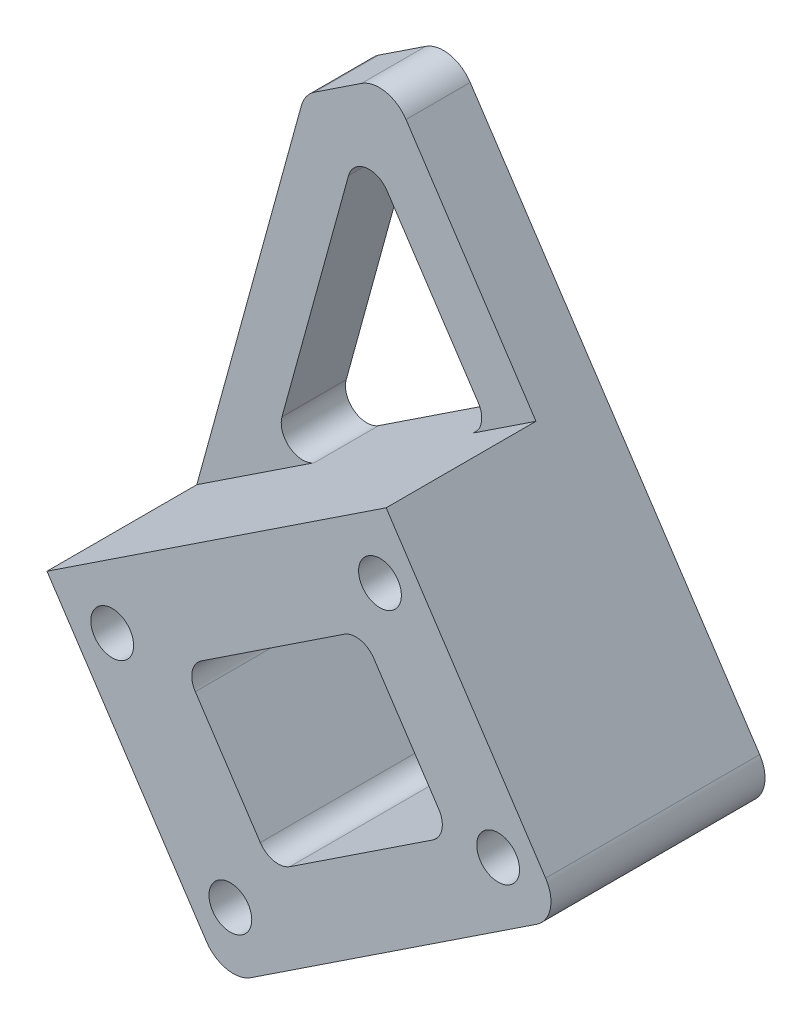
ISO-10303-21;
HEADER;
FILE_DESCRIPTION(('STEP AP214'),'2;1');
FILE_NAME('part.step','',(''),(''),'','','');
FILE_SCHEMA(('AUTOMOTIVE_DESIGN { 1 0 10303 214 1 1 1 1 }'));
ENDSEC;
DATA;
#1=APPLICATION_CONTEXT('core data for automotive mechanical design processes');
#2=APPLICATION_PROTOCOL_DEFINITION('international standard','automotive_design',2000,#1);
#3=PRODUCT_CONTEXT('',#1,'mechanical');
#4=PRODUCT('Part','Part','',(#3));
#5=PRODUCT_RELATED_PRODUCT_CATEGORY('part','',(#4));
#6=PRODUCT_DEFINITION_FORMATION('','',#4);
#7=PRODUCT_DEFINITION_CONTEXT('part definition',#1,'design');
#8=PRODUCT_DEFINITION('design','',#6,#7);
#9=PRODUCT_DEFINITION_SHAPE('','',#8);
#10=(LENGTH_UNIT() NAMED_UNIT(*) SI_UNIT(.MILLI.,.METRE.));
#11=(NAMED_UNIT(*) PLANE_ANGLE_UNIT() SI_UNIT($,.RADIAN.));
#12=(NAMED_UNIT(*) SI_UNIT($,.STERADIAN.) SOLID_ANGLE_UNIT());
#13=UNCERTAINTY_MEASURE_WITH_UNIT(LENGTH_MEASURE(1.E-05),#10,'distance_accuracy_value','');
#14=(GEOMETRIC_REPRESENTATION_CONTEXT(3) GLOBAL_UNCERTAINTY_ASSIGNED_CONTEXT((#13)) GLOBAL_UNIT_ASSIGNED_CONTEXT((#10,
#11,#12)) REPRESENTATION_CONTEXT('',''));
#15=CARTESIAN_POINT('',(0.,0.,0.));
#16=DIRECTION('',(0.,0.,1.));
#17=DIRECTION('',(1.,0.,0.));
#18=AXIS2_PLACEMENT_3D('',#15,#16,#17);
#19=CARTESIAN_POINT('',(-6.14019511825467,-29.2611944056386,20.));
#20=DIRECTION('',(0.,0.,1.));
#21=DIRECTION('',(1.,0.,0.));
#22=AXIS2_PLACEMENT_3D('',#19,#20,#21);
#23=PLANE('',#22);
#24=DIRECTION('',(0.833885822066982,0.55193698531234,0.));
#25=VECTOR('',#24,1.);
#26=CARTESIAN_POINT('',(-12.5539669439001,-1.12784389978526,20.));
#27=LINE('',#26,#25);
#28=CARTESIAN_POINT('',(-23.5441511878888,-8.40208816576704,20.));
#29=VERTEX_POINT('',#28);
#30=CARTESIAN_POINT('',(8.14351005065652,12.5715172761019,20.));
#31=VERTEX_POINT('',#30);
#32=EDGE_CURVE('E301',#29,#31,#27,.T.);
#33=ORIENTED_EDGE('',*,*,#32,.F.);
#34=DIRECTION('',(0.55193698531234,-0.833885822066982,0.));
#35=VECTOR('',#34,1.);
#36=CARTESIAN_POINT('',(-23.5441511878888,-8.40208816576704,20.));
#37=LINE('',#36,#35);
#38=CARTESIAN_POINT('',(-8.64185258445563,-30.9170053615756,20.));
#39=VERTEX_POINT('',#38);
#40=EDGE_CURVE('E236',#29,#39,#37,.T.);
#41=ORIENTED_EDGE('',*,*,#40,.T.);
#42=CARTESIAN_POINT('',(-6.14019511825467,-29.2611944056386,20.));
#43=DIRECTION('',(0.,0.,1.));
#44=DIRECTION('',(1.,0.,0.));
#45=AXIS2_PLACEMENT_3D('',#42,#43,#44);
#46=CIRCLE('',#45,2.99999999999999);
#47=CARTESIAN_POINT('',(-4.48438416231764,-31.7628518718395,20.));
#48=VERTEX_POINT('',#47);
#49=EDGE_CURVE('E261',#39,#48,#46,.T.);
#50=ORIENTED_EDGE('',*,*,#49,.T.);
#51=DIRECTION('',(0.833885822066982,0.55193698531234,0.));
#52=VECTOR('',#51,1.);
#53=CARTESIAN_POINT('',(-4.48438416231764,-31.7628518718395,20.));
#54=LINE('',#53,#52);
#55=CARTESIAN_POINT('',(22.1999621438258,-14.1008683418447,20.));
#56=VERTEX_POINT('',#55);
#57=EDGE_CURVE('E291',#48,#56,#54,.T.);
#58=ORIENTED_EDGE('',*,*,#57,.T.);
#59=CARTESIAN_POINT('',(20.5441511878888,-11.5992108756437,20.));
#60=DIRECTION('',(0.,0.,1.));
#61=DIRECTION('',(1.,0.,0.));
#62=AXIS2_PLACEMENT_3D('',#59,#60,#61);
#63=CIRCLE('',#62,3.);
#64=CARTESIAN_POINT('',(23.0458086540897,-9.94339991970666,20.));
#65=VERTEX_POINT('',#64);
#66=EDGE_CURVE('E295',#56,#65,#63,.T.);
#67=ORIENTED_EDGE('',*,*,#66,.T.);
#68=DIRECTION('',(-0.551936985312339,0.833885822066982,0.));
#69=VECTOR('',#68,1.);
#70=CARTESIAN_POINT('',(23.0458086540897,-9.94339991970666,20.));
#71=LINE('',#70,#69);
#72=EDGE_CURVE('E232',#65,#31,#71,.T.);
#73=ORIENTED_EDGE('',*,*,#72,.T.);
#74=EDGE_LOOP('',(#33,#41,#50,#58,#67,#73));
#75=FACE_BOUND('',#74,.T.);
#76=CARTESIAN_POINT('',(-17.4489229730591,-10.3637693348526,20.));
#77=DIRECTION('',(0.,0.,1.));
#78=DIRECTION('',(1.,0.,0.));
#79=AXIS2_PLACEMENT_3D('',#76,#77,#78);
#80=CIRCLE('',#79,1.99999999999999);
#81=CARTESIAN_POINT('',(-15.4489229730591,-10.3637693348526,20.));
#82=VERTEX_POINT('',#81);
#83=EDGE_CURVE('E364',#82,#82,#80,.T.);
#84=ORIENTED_EDGE('',*,*,#83,.F.);
#85=EDGE_LOOP('',(#84));
#86=FACE_BOUND('',#85,.T.);
#87=CARTESIAN_POINT('',(18.6063913951971,-10.483376216822,20.));
#88=DIRECTION('',(0.,0.,1.));
#89=DIRECTION('',(1.,0.,0.));
#90=AXIS2_PLACEMENT_3D('',#87,#88,#89);
#91=CIRCLE('',#90,2.00000000000001);
#92=CARTESIAN_POINT('',(20.6063913951971,-10.483376216822,20.));
#93=VERTEX_POINT('',#92);
#94=EDGE_CURVE('E376',#93,#93,#91,.T.);
#95=ORIENTED_EDGE('',*,*,#94,.F.);
#96=EDGE_LOOP('',(#95));
#97=FACE_BOUND('',#96,.T.);
#98=DIRECTION('',(0.551936985312339,-0.833885822066982,0.));
#99=VECTOR('',#98,1.);
#100=CARTESIAN_POINT('',(-9.68592311409555,-11.2215765333135,20.));
#101=LINE('',#100,#99);
#102=CARTESIAN_POINT('',(-9.68592311409555,-11.2215765333135,20.));
#103=VERTEX_POINT('',#102);
#104=CARTESIAN_POINT('',(-3.61461627565982,-20.3943205760503,20.));
#105=VERTEX_POINT('',#104);
#106=EDGE_CURVE('E384',#103,#105,#101,.T.);
#107=ORIENTED_EDGE('',*,*,#106,.F.);
#108=CARTESIAN_POINT('',(-8.0181514699616,-10.1177025626888,20.));
#109=DIRECTION('',(0.,0.,1.));
#110=DIRECTION('',(1.,0.,0.));
#111=AXIS2_PLACEMENT_3D('',#108,#109,#110);
#112=CIRCLE('',#111,1.99999999999999);
#113=CARTESIAN_POINT('',(-9.12202544058627,-8.44993091855484,20.));
#114=VERTEX_POINT('',#113);
#115=EDGE_CURVE('E382',#114,#103,#112,.T.);
#116=ORIENTED_EDGE('',*,*,#115,.F.);
#117=DIRECTION('',(-0.833885822066983,-0.551936985312339,0.));
#118=VECTOR('',#117,1.);
#119=CARTESIAN_POINT('',(4.22014771248544,0.381060846442571,20.));
#120=LINE('',#119,#118);
#121=CARTESIAN_POINT('',(4.22014771248545,0.381060846442573,20.));
#122=VERTEX_POINT('',#121);
#123=EDGE_CURVE('E398',#122,#114,#120,.T.);
#124=ORIENTED_EDGE('',*,*,#123,.F.);
#125=CARTESIAN_POINT('',(5.32402168311014,-1.28671079769138,20.));
#126=DIRECTION('',(0.,0.,1.));
#127=DIRECTION('',(1.,0.,0.));
#128=AXIS2_PLACEMENT_3D('',#125,#126,#127);
#129=CIRCLE('',#128,1.99999999999999);
#130=CARTESIAN_POINT('',(6.99179332724409,-0.182836827066712,20.));
#131=VERTEX_POINT('',#130);
#132=EDGE_CURVE('E395',#131,#122,#129,.T.);
#133=ORIENTED_EDGE('',*,*,#132,.F.);
#134=DIRECTION('',(-0.551936985312341,0.833885822066981,0.));
#135=VECTOR('',#134,1.);
#136=CARTESIAN_POINT('',(13.0631001656798,-9.35558086980348,20.));
#137=LINE('',#136,#135);
#138=CARTESIAN_POINT('',(13.0631001656798,-9.35558086980347,20.));
#139=VERTEX_POINT('',#138);
#140=EDGE_CURVE('E393',#139,#131,#137,.T.);
#141=ORIENTED_EDGE('',*,*,#140,.F.);
#142=CARTESIAN_POINT('',(11.3953285215458,-10.4594548404282,20.));
#143=DIRECTION('',(0.,0.,1.));
#144=DIRECTION('',(1.,0.,0.));
#145=AXIS2_PLACEMENT_3D('',#142,#143,#144);
#146=CIRCLE('',#145,2.00000000000003);
#147=CARTESIAN_POINT('',(12.4992024921705,-12.1272264845622,20.));
#148=VERTEX_POINT('',#147);
#149=EDGE_CURVE('E391',#148,#139,#146,.T.);
#150=ORIENTED_EDGE('',*,*,#149,.F.);
#151=DIRECTION('',(0.833885822066983,0.551936985312339,0.));
#152=VECTOR('',#151,1.);
#153=CARTESIAN_POINT('',(-0.842970660901166,-20.9582182495596,20.));
#154=LINE('',#153,#152);
#155=CARTESIAN_POINT('',(-0.84297066090117,-20.9582182495596,20.));
#156=VERTEX_POINT('',#155);
#157=EDGE_CURVE('E389',#156,#148,#154,.T.);
#158=ORIENTED_EDGE('',*,*,#157,.F.);
#159=CARTESIAN_POINT('',(-1.94684463152586,-19.2904466054256,20.));
#160=DIRECTION('',(0.,0.,1.));
#161=DIRECTION('',(1.,0.,0.));
#162=AXIS2_PLACEMENT_3D('',#159,#160,#161);
#163=CIRCLE('',#162,1.99999999999999);
#164=EDGE_CURVE('E387',#105,#156,#163,.T.);
#165=ORIENTED_EDGE('',*,*,#164,.F.);
#166=EDGE_LOOP('',(#107,#116,#124,#133,#141,#150,#158,#165));
#167=FACE_BOUND('',#166,.T.);
#168=CARTESIAN_POINT('',(-6.41018326681236,-27.0414857761923,20.));
#169=DIRECTION('',(0.,0.,1.));
#170=DIRECTION('',(1.,0.,0.));
#171=AXIS2_PLACEMENT_3D('',#168,#169,#170);
#172=CIRCLE('',#171,2.);
#173=CARTESIAN_POINT('',(-4.41018326681237,-27.0414857761923,20.));
#174=VERTEX_POINT('',#173);
#175=EDGE_CURVE('E370',#174,#174,#172,.T.);
#176=ORIENTED_EDGE('',*,*,#175,.F.);
#177=EDGE_LOOP('',(#176));
#178=FACE_BOUND('',#177,.T.);
#179=CARTESIAN_POINT('',(7.56765168895032,6.19434022451759,20.));
#180=DIRECTION('',(0.,0.,1.));
#181=DIRECTION('',(1.,0.,0.));
#182=AXIS2_PLACEMENT_3D('',#179,#180,#181);
#183=CIRCLE('',#182,2.);
#184=CARTESIAN_POINT('',(9.56765168895032,6.19434022451759,20.));
#185=VERTEX_POINT('',#184);
#186=EDGE_CURVE('E329',#185,#185,#183,.T.);
#187=ORIENTED_EDGE('',*,*,#186,.F.);
#188=EDGE_LOOP('',(#187));
#189=FACE_BOUND('',#188,.T.);
#190=ADVANCED_FACE('F40',(#75,#86,#97,#167,#178,#189),#23,.T.);
#191=CARTESIAN_POINT('',(-6.14019511825467,-29.2611944056386,0.));
#192=DIRECTION('',(0.,0.,1.));
#193=DIRECTION('',(1.,0.,0.));
#194=AXIS2_PLACEMENT_3D('',#191,#192,#193);
#195=PLANE('',#194);
#196=CARTESIAN_POINT('',(-17.4489229730591,-10.3637693348526,0.));
#197=DIRECTION('',(0.,0.,1.));
#198=DIRECTION('',(1.,0.,0.));
#199=AXIS2_PLACEMENT_3D('',#196,#197,#198);
#200=CIRCLE('',#199,1.99999999999999);
#201=CARTESIAN_POINT('',(-15.4489229730591,-10.3637693348526,0.));
#202=VERTEX_POINT('',#201);
#203=EDGE_CURVE('E363',#202,#202,#200,.T.);
#204=ORIENTED_EDGE('',*,*,#203,.T.);
#205=EDGE_LOOP('',(#204));
#206=FACE_BOUND('',#205,.T.);
#207=CARTESIAN_POINT('',(-6.41018326681236,-27.0414857761923,0.));
#208=DIRECTION('',(0.,0.,1.));
#209=DIRECTION('',(1.,0.,0.));
#210=AXIS2_PLACEMENT_3D('',#207,#208,#209);
#211=CIRCLE('',#210,2.);
#212=CARTESIAN_POINT('',(-4.41018326681237,-27.0414857761923,0.));
#213=VERTEX_POINT('',#212);
#214=EDGE_CURVE('E367',#213,#213,#211,.T.);
#215=ORIENTED_EDGE('',*,*,#214,.T.);
#216=EDGE_LOOP('',(#215));
#217=FACE_BOUND('',#216,.T.);
#218=CARTESIAN_POINT('',(18.6063913951971,-10.483376216822,0.));
#219=DIRECTION('',(0.,0.,1.));
#220=DIRECTION('',(1.,0.,0.));
#221=AXIS2_PLACEMENT_3D('',#218,#219,#220);
#222=CIRCLE('',#221,2.00000000000001);
#223=CARTESIAN_POINT('',(20.6063913951971,-10.483376216822,0.));
#224=VERTEX_POINT('',#223);
#225=EDGE_CURVE('E373',#224,#224,#222,.T.);
#226=ORIENTED_EDGE('',*,*,#225,.T.);
#227=EDGE_LOOP('',(#226));
#228=FACE_BOUND('',#227,.T.);
#229=CARTESIAN_POINT('',(-8.0181514699616,-10.1177025626888,0.));
#230=DIRECTION('',(0.,0.,1.));
#231=DIRECTION('',(1.,0.,0.));
#232=AXIS2_PLACEMENT_3D('',#229,#230,#231);
#233=CIRCLE('',#232,1.99999999999999);
#234=CARTESIAN_POINT('',(-9.12202544058627,-8.44993091855484,0.));
#235=VERTEX_POINT('',#234);
#236=CARTESIAN_POINT('',(-9.68592311409555,-11.2215765333135,0.));
#237=VERTEX_POINT('',#236);
#238=EDGE_CURVE('E379',#235,#237,#233,.T.);
#239=ORIENTED_EDGE('',*,*,#238,.T.);
#240=DIRECTION('',(0.551936985312339,-0.833885822066982,0.));
#241=VECTOR('',#240,1.);
#242=CARTESIAN_POINT('',(-9.68592311409555,-11.2215765333135,0.));
#243=LINE('',#242,#241);
#244=CARTESIAN_POINT('',(-3.61461627565982,-20.3943205760503,0.));
#245=VERTEX_POINT('',#244);
#246=EDGE_CURVE('E403',#237,#245,#243,.T.);
#247=ORIENTED_EDGE('',*,*,#246,.T.);
#248=CARTESIAN_POINT('',(-1.94684463152586,-19.2904466054256,0.));
#249=DIRECTION('',(0.,0.,1.));
#250=DIRECTION('',(1.,0.,0.));
#251=AXIS2_PLACEMENT_3D('',#248,#249,#250);
#252=CIRCLE('',#251,1.99999999999999);
#253=CARTESIAN_POINT('',(-0.84297066090117,-20.9582182495596,0.));
#254=VERTEX_POINT('',#253);
#255=EDGE_CURVE('E406',#245,#254,#252,.T.);
#256=ORIENTED_EDGE('',*,*,#255,.T.);
#257=DIRECTION('',(0.833885822066983,0.551936985312339,0.));
#258=VECTOR('',#257,1.);
#259=CARTESIAN_POINT('',(-0.842970660901166,-20.9582182495596,0.));
#260=LINE('',#259,#258);
#261=CARTESIAN_POINT('',(12.4992024921705,-12.1272264845622,0.));
#262=VERTEX_POINT('',#261);
#263=EDGE_CURVE('E409',#254,#262,#260,.T.);
#264=ORIENTED_EDGE('',*,*,#263,.T.);
#265=CARTESIAN_POINT('',(11.3953285215458,-10.4594548404282,0.));
#266=DIRECTION('',(0.,0.,1.));
#267=DIRECTION('',(1.,0.,0.));
#268=AXIS2_PLACEMENT_3D('',#265,#266,#267);
#269=CIRCLE('',#268,2.00000000000003);
#270=CARTESIAN_POINT('',(13.0631001656798,-9.35558086980347,0.));
#271=VERTEX_POINT('',#270);
#272=EDGE_CURVE('E412',#262,#271,#269,.T.);
#273=ORIENTED_EDGE('',*,*,#272,.T.);
#274=DIRECTION('',(-0.551936985312341,0.833885822066981,0.));
#275=VECTOR('',#274,1.);
#276=CARTESIAN_POINT('',(13.0631001656798,-9.35558086980348,0.));
#277=LINE('',#276,#275);
#278=CARTESIAN_POINT('',(6.99179332724409,-0.182836827066712,0.));
#279=VERTEX_POINT('',#278);
#280=EDGE_CURVE('E415',#271,#279,#277,.T.);
#281=ORIENTED_EDGE('',*,*,#280,.T.);
#282=CARTESIAN_POINT('',(5.32402168311014,-1.28671079769138,0.));
#283=DIRECTION('',(0.,0.,1.));
#284=DIRECTION('',(1.,0.,0.));
#285=AXIS2_PLACEMENT_3D('',#282,#283,#284);
#286=CIRCLE('',#285,1.99999999999999);
#287=CARTESIAN_POINT('',(4.22014771248544,0.381060846442565,0.));
#288=VERTEX_POINT('',#287);
#289=EDGE_CURVE('E418',#279,#288,#286,.T.);
#290=ORIENTED_EDGE('',*,*,#289,.T.);
#291=DIRECTION('',(-0.833885822066983,-0.551936985312339,0.));
#292=VECTOR('',#291,1.);
#293=CARTESIAN_POINT('',(4.22014771248544,0.381060846442571,0.));
#294=LINE('',#293,#292);
#295=EDGE_CURVE('E385',#288,#235,#294,.T.);
#296=ORIENTED_EDGE('',*,*,#295,.T.);
#297=EDGE_LOOP('',(#239,#247,#256,#264,#273,#281,#290,#296));
#298=FACE_BOUND('',#297,.T.);
#299=DIRECTION('',(0.55193698531234,-0.833885822066982,0.));
#300=VECTOR('',#299,1.);
#301=CARTESIAN_POINT('',(-23.5441511878888,-8.40208816576704,0.));
#302=LINE('',#301,#300);
#303=CARTESIAN_POINT('',(-23.5441511878888,-8.40208816576704,0.));
#304=VERTEX_POINT('',#303);
#305=CARTESIAN_POINT('',(-8.64185258445563,-30.9170053615756,0.));
#306=VERTEX_POINT('',#305);
#307=EDGE_CURVE('E262',#304,#306,#302,.T.);
#308=ORIENTED_EDGE('',*,*,#307,.F.);
#309=DIRECTION('',(-0.264870155924735,-0.964284087030584,0.));
#310=VECTOR('',#309,1.);
#311=CARTESIAN_POINT('',(-13.7775427468694,27.154145306643,0.));
#312=LINE('',#311,#310);
#313=CARTESIAN_POINT('',(-13.7775427468694,27.154145306643,0.));
#314=VERTEX_POINT('',#313);
#315=EDGE_CURVE('E228',#314,#304,#312,.T.);
#316=ORIENTED_EDGE('',*,*,#315,.F.);
#317=CARTESIAN_POINT('',(-10.8846904857777,26.3595348388687,0.));
#318=DIRECTION('',(0.,0.,1.));
#319=DIRECTION('',(1.,0.,0.));
#320=AXIS2_PLACEMENT_3D('',#317,#318,#319);
#321=CIRCLE('',#320,3.00000000000002);
#322=CARTESIAN_POINT('',(-12.5405014417147,28.8611923050697,0.));
#323=VERTEX_POINT('',#322);
#324=EDGE_CURVE('E285',#323,#314,#321,.T.);
#325=ORIENTED_EDGE('',*,*,#324,.F.);
#326=DIRECTION('',(-0.833885822066983,-0.551936985312337,0.));
#327=VECTOR('',#326,1.);
#328=CARTESIAN_POINT('',(-8.15657204835288,31.7628518718394,0.));
#329=LINE('',#328,#327);
#330=CARTESIAN_POINT('',(-8.15657204835288,31.7628518718394,0.));
#331=VERTEX_POINT('',#330);
#332=EDGE_CURVE('E283',#331,#323,#329,.T.);
#333=ORIENTED_EDGE('',*,*,#332,.F.);
#334=CARTESIAN_POINT('',(-6.50076109241587,29.2611944056385,0.));
#335=DIRECTION('',(0.,0.,1.));
#336=DIRECTION('',(1.,0.,0.));
#337=AXIS2_PLACEMENT_3D('',#334,#335,#336);
#338=CIRCLE('',#337,2.99999999999997);
#339=CARTESIAN_POINT('',(-3.99910362621493,30.9170053615754,0.));
#340=VERTEX_POINT('',#339);
#341=EDGE_CURVE('E280',#340,#331,#338,.T.);
#342=ORIENTED_EDGE('',*,*,#341,.F.);
#343=DIRECTION('',(-0.551936985312339,0.833885822066982,0.));
#344=VECTOR('',#343,1.);
#345=CARTESIAN_POINT('',(23.0458086540897,-9.94339991970666,0.));
#346=LINE('',#345,#344);
#347=CARTESIAN_POINT('',(23.0458086540897,-9.94339991970666,0.));
#348=VERTEX_POINT('',#347);
#349=EDGE_CURVE('E277',#348,#340,#346,.T.);
#350=ORIENTED_EDGE('',*,*,#349,.F.);
#351=CARTESIAN_POINT('',(20.5441511878888,-11.5992108756437,0.));
#352=DIRECTION('',(0.,0.,1.));
#353=DIRECTION('',(1.,0.,0.));
#354=AXIS2_PLACEMENT_3D('',#351,#352,#353);
#355=CIRCLE('',#354,3.);
#356=CARTESIAN_POINT('',(22.1999621438258,-14.1008683418447,0.));
#357=VERTEX_POINT('',#356);
#358=EDGE_CURVE('E275',#357,#348,#355,.T.);
#359=ORIENTED_EDGE('',*,*,#358,.F.);
#360=DIRECTION('',(0.833885822066982,0.55193698531234,0.));
#361=VECTOR('',#360,1.);
#362=CARTESIAN_POINT('',(-4.48438416231764,-31.7628518718395,0.));
#363=LINE('',#362,#361);
#364=CARTESIAN_POINT('',(-4.48438416231764,-31.7628518718395,0.));
#365=VERTEX_POINT('',#364);
#366=EDGE_CURVE('E266',#365,#357,#363,.T.);
#367=ORIENTED_EDGE('',*,*,#366,.F.);
#368=CARTESIAN_POINT('',(-6.14019511825467,-29.2611944056386,0.));
#369=DIRECTION('',(0.,0.,1.));
#370=DIRECTION('',(1.,0.,0.));
#371=AXIS2_PLACEMENT_3D('',#368,#369,#370);
#372=CIRCLE('',#371,2.99999999999999);
#373=EDGE_CURVE('E260',#306,#365,#372,.T.);
#374=ORIENTED_EDGE('',*,*,#373,.F.);
#375=EDGE_LOOP('',(#308,#316,#325,#333,#342,#350,#359,#367,#374));
#376=FACE_BOUND('',#375,.T.);
#377=CARTESIAN_POINT('',(-13.6578409145248,0.539927744348745,0.));
#378=DIRECTION('',(0.,0.,1.));
#379=DIRECTION('',(1.,0.,0.));
#380=AXIS2_PLACEMENT_3D('',#377,#378,#379);
#381=CIRCLE('',#380,2.);
#382=CARTESIAN_POINT('',(-15.5864090885859,1.06966805619818,0.));
#383=VERTEX_POINT('',#382);
#384=CARTESIAN_POINT('',(-12.5539669439001,-1.12784389978526,0.));
#385=VERTEX_POINT('',#384);
#386=EDGE_CURVE('E332',#383,#385,#381,.T.);
#387=ORIENTED_EDGE('',*,*,#386,.T.);
#388=DIRECTION('',(0.833885822066982,0.55193698531234,0.));
#389=VECTOR('',#388,1.);
#390=CARTESIAN_POINT('',(-12.5539669439001,-1.12784389978526,0.));
#391=LINE('',#390,#389);
#392=CARTESIAN_POINT('',(2.18139836922723,8.62528163992471,0.));
#393=VERTEX_POINT('',#392);
#394=EDGE_CURVE('E339',#385,#393,#391,.T.);
#395=ORIENTED_EDGE('',*,*,#394,.T.);
#396=CARTESIAN_POINT('',(1.07752439860254,10.2930532840587,0.));
#397=DIRECTION('',(0.,0.,1.));
#398=DIRECTION('',(1.,0.,0.));
#399=AXIS2_PLACEMENT_3D('',#396,#397,#398);
#400=CIRCLE('',#399,2.);
#401=CARTESIAN_POINT('',(2.74529604273651,11.3969272546833,0.));
#402=VERTEX_POINT('',#401);
#403=EDGE_CURVE('E342',#393,#402,#400,.T.);
#404=ORIENTED_EDGE('',*,*,#403,.T.);
#405=DIRECTION('',(-0.55193698531234,0.833885822066982,0.));
#406=VECTOR('',#405,1.);
#407=CARTESIAN_POINT('',(2.74529604273652,11.3969272546833,0.));
#408=LINE('',#407,#406);
#409=CARTESIAN_POINT('',(-5.77512440066252,24.269878324957,0.));
#410=VERTEX_POINT('',#409);
#411=EDGE_CURVE('E345',#402,#410,#408,.T.);
#412=ORIENTED_EDGE('',*,*,#411,.T.);
#413=CARTESIAN_POINT('',(-7.44289604479648,23.1660043543324,0.));
#414=DIRECTION('',(0.,0.,1.));
#415=DIRECTION('',(1.,0.,0.));
#416=AXIS2_PLACEMENT_3D('',#413,#414,#415);
#417=CIRCLE('',#416,2.00000000000001);
#418=CARTESIAN_POINT('',(-9.37146421885765,23.6957446661818,0.));
#419=VERTEX_POINT('',#418);
#420=EDGE_CURVE('E348',#410,#419,#417,.T.);
#421=ORIENTED_EDGE('',*,*,#420,.T.);
#422=DIRECTION('',(-0.264870155924733,-0.964284087030584,0.));
#423=VECTOR('',#422,1.);
#424=CARTESIAN_POINT('',(-9.37146421885768,23.6957446661819,0.));
#425=LINE('',#424,#423);
#426=EDGE_CURVE('E336',#419,#383,#425,.T.);
#427=ORIENTED_EDGE('',*,*,#426,.T.);
#428=EDGE_LOOP('',(#387,#395,#404,#412,#421,#427));
#429=FACE_BOUND('',#428,.T.);
#430=CARTESIAN_POINT('',(7.56765168895032,6.19434022451759,0.));
#431=DIRECTION('',(0.,0.,1.));
#432=DIRECTION('',(1.,0.,0.));
#433=AXIS2_PLACEMENT_3D('',#430,#431,#432);
#434=CIRCLE('',#433,2.);
#435=CARTESIAN_POINT('',(9.56765168895032,6.19434022451759,0.));
#436=VERTEX_POINT('',#435);
#437=EDGE_CURVE('E328',#436,#436,#434,.T.);
#438=ORIENTED_EDGE('',*,*,#437,.T.);
#439=EDGE_LOOP('',(#438));
#440=FACE_BOUND('',#439,.T.);
#441=ADVANCED_FACE('F446',(#206,#217,#228,#298,#376,#429,#440),#195,.F.);
#442=CARTESIAN_POINT('',(-23.5441511878888,-8.40208816576704,20.));
#443=DIRECTION('',(0.833885822066982,0.55193698531234,0.));
#444=DIRECTION('',(-0.55193698531234,0.833885822066982,0.));
#445=AXIS2_PLACEMENT_3D('',#442,#443,#444);
#446=PLANE('',#445);
#447=ORIENTED_EDGE('',*,*,#307,.T.);
#448=DIRECTION('',(0.,0.,-1.));
#449=VECTOR('',#448,1.);
#450=CARTESIAN_POINT('',(-8.64185258445563,-30.9170053615756,20.));
#451=LINE('',#450,#449);
#452=EDGE_CURVE('E48',#39,#306,#451,.T.);
#453=ORIENTED_EDGE('',*,*,#452,.F.);
#454=ORIENTED_EDGE('',*,*,#40,.F.);
#455=DIRECTION('',(0.,0.,-1.));
#456=VECTOR('',#455,1.);
#457=CARTESIAN_POINT('',(-23.5441511878888,-8.40208816576704,20.));
#458=LINE('',#457,#456);
#459=CARTESIAN_POINT('',(-23.5441511878888,-8.40208816576704,6.));
#460=VERTEX_POINT('',#459);
#461=EDGE_CURVE('E217',#29,#460,#458,.T.);
#462=ORIENTED_EDGE('',*,*,#461,.T.);
#463=EDGE_CURVE('E225',#460,#304,#458,.T.);
#464=ORIENTED_EDGE('',*,*,#463,.T.);
#465=EDGE_LOOP('',(#447,#453,#454,#462,#464));
#466=FACE_BOUND('',#465,.T.);
#467=ADVANCED_FACE('F42',(#466),#446,.F.);
#468=CARTESIAN_POINT('',(-6.14019511825467,-29.2611944056386,20.));
#469=DIRECTION('',(0.,0.,-1.));
#470=DIRECTION('',(-1.,0.,0.));
#471=AXIS2_PLACEMENT_3D('',#468,#469,#470);
#472=CYLINDRICAL_SURFACE('',#471,2.99999999999999);
#473=ORIENTED_EDGE('',*,*,#373,.T.);
#474=DIRECTION('',(0.,0.,-1.));
#475=VECTOR('',#474,1.);
#476=CARTESIAN_POINT('',(-4.48438416231764,-31.7628518718395,20.));
#477=LINE('',#476,#475);
#478=EDGE_CURVE('E254',#48,#365,#477,.T.);
#479=ORIENTED_EDGE('',*,*,#478,.F.);
#480=ORIENTED_EDGE('',*,*,#49,.F.);
#481=ORIENTED_EDGE('',*,*,#452,.T.);
#482=EDGE_LOOP('',(#473,#479,#480,#481));
#483=FACE_BOUND('',#482,.T.);
#484=ADVANCED_FACE('F258',(#483),#472,.T.);
#485=CARTESIAN_POINT('',(-4.48438416231764,-31.7628518718395,20.));
#486=DIRECTION('',(-0.55193698531234,0.833885822066982,0.));
#487=DIRECTION('',(-0.833885822066982,-0.55193698531234,0.));
#488=AXIS2_PLACEMENT_3D('',#485,#486,#487);
#489=PLANE('',#488);
#490=ORIENTED_EDGE('',*,*,#366,.T.);
#491=DIRECTION('',(0.,0.,-1.));
#492=VECTOR('',#491,1.);
#493=CARTESIAN_POINT('',(22.1999621438258,-14.1008683418447,20.));
#494=LINE('',#493,#492);
#495=EDGE_CURVE('E251',#56,#357,#494,.T.);
#496=ORIENTED_EDGE('',*,*,#495,.F.);
#497=ORIENTED_EDGE('',*,*,#57,.F.);
#498=ORIENTED_EDGE('',*,*,#478,.T.);
#499=EDGE_LOOP('',(#490,#496,#497,#498));
#500=FACE_BOUND('',#499,.T.);
#501=ADVANCED_FACE('F514',(#500),#489,.F.);
#502=CARTESIAN_POINT('',(20.5441511878888,-11.5992108756437,20.));
#503=DIRECTION('',(0.,0.,-1.));
#504=DIRECTION('',(-1.,0.,0.));
#505=AXIS2_PLACEMENT_3D('',#502,#503,#504);
#506=CYLINDRICAL_SURFACE('',#505,3.);
#507=ORIENTED_EDGE('',*,*,#358,.T.);
#508=DIRECTION('',(0.,0.,-1.));
#509=VECTOR('',#508,1.);
#510=CARTESIAN_POINT('',(23.0458086540897,-9.94339991970666,20.));
#511=LINE('',#510,#509);
#512=EDGE_CURVE('E248',#65,#348,#511,.T.);
#513=ORIENTED_EDGE('',*,*,#512,.F.);
#514=ORIENTED_EDGE('',*,*,#66,.F.);
#515=ORIENTED_EDGE('',*,*,#495,.T.);
#516=EDGE_LOOP('',(#507,#513,#514,#515));
#517=FACE_BOUND('',#516,.T.);
#518=ADVANCED_FACE('F511',(#517),#506,.T.);
#519=CARTESIAN_POINT('',(23.0458086540897,-9.94339991970666,20.));
#520=DIRECTION('',(-0.833885822066982,-0.551936985312339,0.));
#521=DIRECTION('',(0.551936985312339,-0.833885822066982,0.));
#522=AXIS2_PLACEMENT_3D('',#519,#520,#521);
#523=PLANE('',#522);
#524=DIRECTION('',(0.551936985312339,-0.833885822066982,0.));
#525=VECTOR('',#524,1.);
#526=CARTESIAN_POINT('',(23.0458086540897,-9.94339991970666,6.));
#527=LINE('',#526,#525);
#528=CARTESIAN_POINT('',(-3.99910362621493,30.9170053615754,6.));
#529=VERTEX_POINT('',#528);
#530=CARTESIAN_POINT('',(8.14351005065652,12.5715172761019,6.));
#531=VERTEX_POINT('',#530);
#532=EDGE_CURVE('E309',#529,#531,#527,.T.);
#533=ORIENTED_EDGE('',*,*,#532,.T.);
#534=DIRECTION('',(0.,0.,1.));
#535=VECTOR('',#534,1.);
#536=CARTESIAN_POINT('',(8.14351005065652,12.5715172761019,6.));
#537=LINE('',#536,#535);
#538=EDGE_CURVE('E221',#531,#31,#537,.T.);
#539=ORIENTED_EDGE('',*,*,#538,.T.);
#540=ORIENTED_EDGE('',*,*,#72,.F.);
#541=ORIENTED_EDGE('',*,*,#512,.T.);
#542=ORIENTED_EDGE('',*,*,#349,.T.);
#543=DIRECTION('',(0.,0.,-1.));
#544=VECTOR('',#543,1.);
#545=CARTESIAN_POINT('',(-3.99910362621493,30.9170053615754,20.));
#546=LINE('',#545,#544);
#547=EDGE_CURVE('E246',#529,#340,#546,.T.);
#548=ORIENTED_EDGE('',*,*,#547,.F.);
#549=EDGE_LOOP('',(#533,#539,#540,#541,#542,#548));
#550=FACE_BOUND('',#549,.T.);
#551=ADVANCED_FACE('F305',(#550),#523,.F.);
#552=CARTESIAN_POINT('',(-6.50076109241587,29.2611944056385,20.));
#553=DIRECTION('',(0.,0.,-1.));
#554=DIRECTION('',(-1.,0.,0.));
#555=AXIS2_PLACEMENT_3D('',#552,#553,#554);
#556=CYLINDRICAL_SURFACE('',#555,2.99999999999997);
#557=DIRECTION('',(0.,0.,-1.));
#558=VECTOR('',#557,1.);
#559=CARTESIAN_POINT('',(-8.15657204835288,31.7628518718394,20.));
#560=LINE('',#559,#558);
#561=CARTESIAN_POINT('',(-8.15657204835288,31.7628518718394,6.));
#562=VERTEX_POINT('',#561);
#563=EDGE_CURVE('E244',#562,#331,#560,.T.);
#564=ORIENTED_EDGE('',*,*,#563,.F.);
#565=CARTESIAN_POINT('',(-6.50076109241587,29.2611944056385,6.));
#566=DIRECTION('',(0.,0.,-1.));
#567=DIRECTION('',(-1.,0.,0.));
#568=AXIS2_PLACEMENT_3D('',#565,#566,#567);
#569=CIRCLE('',#568,2.99999999999997);
#570=EDGE_CURVE('E324',#562,#529,#569,.T.);
#571=ORIENTED_EDGE('',*,*,#570,.T.);
#572=ORIENTED_EDGE('',*,*,#547,.T.);
#573=ORIENTED_EDGE('',*,*,#341,.T.);
#574=EDGE_LOOP('',(#564,#571,#572,#573));
#575=FACE_BOUND('',#574,.T.);
#576=ADVANCED_FACE('F504',(#575),#556,.T.);
#577=CARTESIAN_POINT('',(-8.15657204835288,31.7628518718394,20.));
#578=DIRECTION('',(0.551936985312337,-0.833885822066984,0.));
#579=DIRECTION('',(0.833885822066984,0.551936985312337,0.));
#580=AXIS2_PLACEMENT_3D('',#577,#578,#579);
#581=PLANE('',#580);
#582=DIRECTION('',(0.,0.,-1.));
#583=VECTOR('',#582,1.);
#584=CARTESIAN_POINT('',(-12.5405014417147,28.8611923050697,20.));
#585=LINE('',#584,#583);
#586=CARTESIAN_POINT('',(-12.5405014417147,28.8611923050697,6.));
#587=VERTEX_POINT('',#586);
#588=EDGE_CURVE('E238',#587,#323,#585,.T.);
#589=ORIENTED_EDGE('',*,*,#588,.F.);
#590=DIRECTION('',(0.833885822066984,0.551936985312337,0.));
#591=VECTOR('',#590,1.);
#592=CARTESIAN_POINT('',(-8.15657204835288,31.7628518718394,6.));
#593=LINE('',#592,#591);
#594=EDGE_CURVE('E321',#587,#562,#593,.T.);
#595=ORIENTED_EDGE('',*,*,#594,.T.);
#596=ORIENTED_EDGE('',*,*,#563,.T.);
#597=ORIENTED_EDGE('',*,*,#332,.T.);
#598=EDGE_LOOP('',(#589,#595,#596,#597));
#599=FACE_BOUND('',#598,.T.);
#600=ADVANCED_FACE('F501',(#599),#581,.F.);
#601=CARTESIAN_POINT('',(-10.8846904857777,26.3595348388687,20.));
#602=DIRECTION('',(0.,0.,-1.));
#603=DIRECTION('',(-1.,0.,0.));
#604=AXIS2_PLACEMENT_3D('',#601,#602,#603);
#605=CYLINDRICAL_SURFACE('',#604,3.00000000000002);
#606=DIRECTION('',(0.,0.,-1.));
#607=VECTOR('',#606,1.);
#608=CARTESIAN_POINT('',(-13.7775427468694,27.154145306643,20.));
#609=LINE('',#608,#607);
#610=CARTESIAN_POINT('',(-13.7775427468694,27.154145306643,6.));
#611=VERTEX_POINT('',#610);
#612=EDGE_CURVE('E237',#611,#314,#609,.T.);
#613=ORIENTED_EDGE('',*,*,#612,.F.);
#614=CARTESIAN_POINT('',(-10.8846904857777,26.3595348388687,6.));
#615=DIRECTION('',(0.,0.,-1.));
#616=DIRECTION('',(-1.,0.,0.));
#617=AXIS2_PLACEMENT_3D('',#614,#615,#616);
#618=CIRCLE('',#617,3.00000000000002);
#619=EDGE_CURVE('E207',#611,#587,#618,.T.);
#620=ORIENTED_EDGE('',*,*,#619,.T.);
#621=ORIENTED_EDGE('',*,*,#588,.T.);
#622=ORIENTED_EDGE('',*,*,#324,.T.);
#623=EDGE_LOOP('',(#613,#620,#621,#622));
#624=FACE_BOUND('',#623,.T.);
#625=ADVANCED_FACE('F498',(#624),#605,.T.);
#626=CARTESIAN_POINT('',(-13.7775427468694,27.154145306643,20.));
#627=DIRECTION('',(0.964284087030584,-0.264870155924735,0.));
#628=DIRECTION('',(0.264870155924735,0.964284087030584,0.));
#629=AXIS2_PLACEMENT_3D('',#626,#627,#628);
#630=PLANE('',#629);
#631=ORIENTED_EDGE('',*,*,#463,.F.);
#632=DIRECTION('',(0.264870155924735,0.964284087030584,0.));
#633=VECTOR('',#632,1.);
#634=CARTESIAN_POINT('',(-13.7775427468694,27.154145306643,6.));
#635=LINE('',#634,#633);
#636=EDGE_CURVE('E202',#460,#611,#635,.T.);
#637=ORIENTED_EDGE('',*,*,#636,.T.);
#638=ORIENTED_EDGE('',*,*,#612,.T.);
#639=ORIENTED_EDGE('',*,*,#315,.T.);
#640=EDGE_LOOP('',(#631,#637,#638,#639));
#641=FACE_BOUND('',#640,.T.);
#642=ADVANCED_FACE('F226',(#641),#630,.F.);
#643=CARTESIAN_POINT('',(-8.0181514699616,-10.1177025626888,20.));
#644=DIRECTION('',(0.,0.,-1.));
#645=DIRECTION('',(-1.,0.,0.));
#646=AXIS2_PLACEMENT_3D('',#643,#644,#645);
#647=CYLINDRICAL_SURFACE('',#646,1.99999999999999);
#648=ORIENTED_EDGE('',*,*,#238,.F.);
#649=DIRECTION('',(0.,0.,-1.));
#650=VECTOR('',#649,1.);
#651=CARTESIAN_POINT('',(-9.12202544058627,-8.44993091855484,20.));
#652=LINE('',#651,#650);
#653=EDGE_CURVE('E400',#114,#235,#652,.T.);
#654=ORIENTED_EDGE('',*,*,#653,.F.);
#655=ORIENTED_EDGE('',*,*,#115,.T.);
#656=DIRECTION('',(0.,0.,-1.));
#657=VECTOR('',#656,1.);
#658=CARTESIAN_POINT('',(-9.68592311409555,-11.2215765333135,20.));
#659=LINE('',#658,#657);
#660=EDGE_CURVE('E264',#103,#237,#659,.T.);
#661=ORIENTED_EDGE('',*,*,#660,.T.);
#662=EDGE_LOOP('',(#648,#654,#655,#661));
#663=FACE_BOUND('',#662,.T.);
#664=ADVANCED_FACE('F450',(#663),#647,.F.);
#665=CARTESIAN_POINT('',(-9.68592311409555,-11.2215765333135,20.));
#666=DIRECTION('',(0.833885822066983,0.551936985312339,0.));
#667=DIRECTION('',(-0.551936985312339,0.833885822066983,0.));
#668=AXIS2_PLACEMENT_3D('',#665,#666,#667);
#669=PLANE('',#668);
#670=ORIENTED_EDGE('',*,*,#246,.F.);
#671=ORIENTED_EDGE('',*,*,#660,.F.);
#672=ORIENTED_EDGE('',*,*,#106,.T.);
#673=DIRECTION('',(0.,0.,-1.));
#674=VECTOR('',#673,1.);
#675=CARTESIAN_POINT('',(-3.61461627565982,-20.3943205760503,20.));
#676=LINE('',#675,#674);
#677=EDGE_CURVE('E269',#105,#245,#676,.T.);
#678=ORIENTED_EDGE('',*,*,#677,.T.);
#679=EDGE_LOOP('',(#670,#671,#672,#678));
#680=FACE_BOUND('',#679,.T.);
#681=ADVANCED_FACE('F437',(#680),#669,.T.);
#682=CARTESIAN_POINT('',(-1.94684463152586,-19.2904466054256,20.));
#683=DIRECTION('',(0.,0.,-1.));
#684=DIRECTION('',(-1.,0.,0.));
#685=AXIS2_PLACEMENT_3D('',#682,#683,#684);
#686=CYLINDRICAL_SURFACE('',#685,1.99999999999999);
#687=ORIENTED_EDGE('',*,*,#255,.F.);
#688=ORIENTED_EDGE('',*,*,#677,.F.);
#689=ORIENTED_EDGE('',*,*,#164,.T.);
#690=DIRECTION('',(0.,0.,-1.));
#691=VECTOR('',#690,1.);
#692=CARTESIAN_POINT('',(-0.84297066090117,-20.9582182495596,20.));
#693=LINE('',#692,#691);
#694=EDGE_CURVE('E433',#156,#254,#693,.T.);
#695=ORIENTED_EDGE('',*,*,#694,.T.);
#696=EDGE_LOOP('',(#687,#688,#689,#695));
#697=FACE_BOUND('',#696,.T.);
#698=ADVANCED_FACE('F442',(#697),#686,.F.);
#699=CARTESIAN_POINT('',(-0.842970660901166,-20.9582182495596,20.));
#700=DIRECTION('',(-0.551936985312339,0.833885822066983,0.));
#701=DIRECTION('',(-0.833885822066983,-0.551936985312339,0.));
#702=AXIS2_PLACEMENT_3D('',#699,#700,#701);
#703=PLANE('',#702);
#704=ORIENTED_EDGE('',*,*,#263,.F.);
#705=ORIENTED_EDGE('',*,*,#694,.F.);
#706=ORIENTED_EDGE('',*,*,#157,.T.);
#707=DIRECTION('',(0.,0.,-1.));
#708=VECTOR('',#707,1.);
#709=CARTESIAN_POINT('',(12.4992024921705,-12.1272264845622,20.));
#710=LINE('',#709,#708);
#711=EDGE_CURVE('E431',#148,#262,#710,.T.);
#712=ORIENTED_EDGE('',*,*,#711,.T.);
#713=EDGE_LOOP('',(#704,#705,#706,#712));
#714=FACE_BOUND('',#713,.T.);
#715=ADVANCED_FACE('F462',(#714),#703,.T.);
#716=CARTESIAN_POINT('',(11.3953285215458,-10.4594548404282,20.));
#717=DIRECTION('',(0.,0.,-1.));
#718=DIRECTION('',(-1.,0.,0.));
#719=AXIS2_PLACEMENT_3D('',#716,#717,#718);
#720=CYLINDRICAL_SURFACE('',#719,2.00000000000003);
#721=ORIENTED_EDGE('',*,*,#272,.F.);
#722=ORIENTED_EDGE('',*,*,#711,.F.);
#723=ORIENTED_EDGE('',*,*,#149,.T.);
#724=DIRECTION('',(0.,0.,-1.));
#725=VECTOR('',#724,1.);
#726=CARTESIAN_POINT('',(13.0631001656798,-9.35558086980347,20.));
#727=LINE('',#726,#725);
#728=EDGE_CURVE('E429',#139,#271,#727,.T.);
#729=ORIENTED_EDGE('',*,*,#728,.T.);
#730=EDGE_LOOP('',(#721,#722,#723,#729));
#731=FACE_BOUND('',#730,.T.);
#732=ADVANCED_FACE('F467',(#731),#720,.F.);
#733=CARTESIAN_POINT('',(13.0631001656798,-9.35558086980348,20.));
#734=DIRECTION('',(-0.833885822066981,-0.551936985312341,0.));
#735=DIRECTION('',(0.551936985312341,-0.833885822066981,0.));
#736=AXIS2_PLACEMENT_3D('',#733,#734,#735);
#737=PLANE('',#736);
#738=ORIENTED_EDGE('',*,*,#280,.F.);
#739=ORIENTED_EDGE('',*,*,#728,.F.);
#740=ORIENTED_EDGE('',*,*,#140,.T.);
#741=DIRECTION('',(0.,0.,-1.));
#742=VECTOR('',#741,1.);
#743=CARTESIAN_POINT('',(6.99179332724409,-0.182836827066712,20.));
#744=LINE('',#743,#742);
#745=EDGE_CURVE('E427',#131,#279,#744,.T.);
#746=ORIENTED_EDGE('',*,*,#745,.T.);
#747=EDGE_LOOP('',(#738,#739,#740,#746));
#748=FACE_BOUND('',#747,.T.);
#749=ADVANCED_FACE('F470',(#748),#737,.T.);
#750=CARTESIAN_POINT('',(5.32402168311014,-1.28671079769138,20.));
#751=DIRECTION('',(0.,0.,-1.));
#752=DIRECTION('',(-1.,0.,0.));
#753=AXIS2_PLACEMENT_3D('',#750,#751,#752);
#754=CYLINDRICAL_SURFACE('',#753,1.99999999999999);
#755=ORIENTED_EDGE('',*,*,#289,.F.);
#756=ORIENTED_EDGE('',*,*,#745,.F.);
#757=ORIENTED_EDGE('',*,*,#132,.T.);
#758=DIRECTION('',(0.,0.,-1.));
#759=VECTOR('',#758,1.);
#760=CARTESIAN_POINT('',(4.22014771248544,0.381060846442565,20.));
#761=LINE('',#760,#759);
#762=EDGE_CURVE('E425',#122,#288,#761,.T.);
#763=ORIENTED_EDGE('',*,*,#762,.T.);
#764=EDGE_LOOP('',(#755,#756,#757,#763));
#765=FACE_BOUND('',#764,.T.);
#766=ADVANCED_FACE('F474',(#765),#754,.F.);
#767=CARTESIAN_POINT('',(4.22014771248544,0.381060846442571,20.));
#768=DIRECTION('',(0.551936985312339,-0.833885822066983,0.));
#769=DIRECTION('',(0.833885822066983,0.551936985312339,0.));
#770=AXIS2_PLACEMENT_3D('',#767,#768,#769);
#771=PLANE('',#770);
#772=ORIENTED_EDGE('',*,*,#295,.F.);
#773=ORIENTED_EDGE('',*,*,#762,.F.);
#774=ORIENTED_EDGE('',*,*,#123,.T.);
#775=ORIENTED_EDGE('',*,*,#653,.T.);
#776=EDGE_LOOP('',(#772,#773,#774,#775));
#777=FACE_BOUND('',#776,.T.);
#778=ADVANCED_FACE('F453',(#777),#771,.T.);
#779=CARTESIAN_POINT('',(18.6063913951971,-10.483376216822,20.));
#780=DIRECTION('',(0.,0.,-1.));
#781=DIRECTION('',(-1.,0.,0.));
#782=AXIS2_PLACEMENT_3D('',#779,#780,#781);
#783=CYLINDRICAL_SURFACE('',#782,2.00000000000001);
#784=ORIENTED_EDGE('',*,*,#225,.F.);
#785=EDGE_LOOP('',(#784));
#786=FACE_BOUND('',#785,.T.);
#787=ORIENTED_EDGE('',*,*,#94,.T.);
#788=EDGE_LOOP('',(#787));
#789=FACE_BOUND('',#788,.T.);
#790=ADVANCED_FACE('F481',(#786,#789),#783,.F.);
#791=CARTESIAN_POINT('',(-6.41018326681236,-27.0414857761923,20.));
#792=DIRECTION('',(0.,0.,-1.));
#793=DIRECTION('',(-1.,0.,0.));
#794=AXIS2_PLACEMENT_3D('',#791,#792,#793);
#795=CYLINDRICAL_SURFACE('',#794,2.);
#796=ORIENTED_EDGE('',*,*,#214,.F.);
#797=EDGE_LOOP('',(#796));
#798=FACE_BOUND('',#797,.T.);
#799=ORIENTED_EDGE('',*,*,#175,.T.);
#800=EDGE_LOOP('',(#799));
#801=FACE_BOUND('',#800,.T.);
#802=ADVANCED_FACE('F638',(#798,#801),#795,.F.);
#803=CARTESIAN_POINT('',(-17.4489229730591,-10.3637693348526,20.));
#804=DIRECTION('',(0.,0.,-1.));
#805=DIRECTION('',(-1.,0.,0.));
#806=AXIS2_PLACEMENT_3D('',#803,#804,#805);
#807=CYLINDRICAL_SURFACE('',#806,1.99999999999999);
#808=ORIENTED_EDGE('',*,*,#203,.F.);
#809=EDGE_LOOP('',(#808));
#810=FACE_BOUND('',#809,.T.);
#811=ORIENTED_EDGE('',*,*,#83,.T.);
#812=EDGE_LOOP('',(#811));
#813=FACE_BOUND('',#812,.T.);
#814=ADVANCED_FACE('F559',(#810,#813),#807,.F.);
#815=CARTESIAN_POINT('',(-13.6578409145248,0.539927744348745,20.));
#816=DIRECTION('',(0.,0.,-1.));
#817=DIRECTION('',(-1.,0.,0.));
#818=AXIS2_PLACEMENT_3D('',#815,#816,#817);
#819=CYLINDRICAL_SURFACE('',#818,2.);
#820=CARTESIAN_POINT('',(-13.6578409145248,0.539927744348745,6.));
#821=DIRECTION('',(0.,0.,-1.));
#822=DIRECTION('',(-1.,0.,0.));
#823=AXIS2_PLACEMENT_3D('',#820,#821,#822);
#824=CIRCLE('',#823,2.);
#825=CARTESIAN_POINT('',(-12.5539669439001,-1.12784389978523,6.));
#826=VERTEX_POINT('',#825);
#827=CARTESIAN_POINT('',(-15.5864090885859,1.06966805619818,6.));
#828=VERTEX_POINT('',#827);
#829=EDGE_CURVE('E54',#826,#828,#824,.T.);
#830=ORIENTED_EDGE('',*,*,#829,.F.);
#831=DIRECTION('',(0.,0.,-1.));
#832=VECTOR('',#831,1.);
#833=CARTESIAN_POINT('',(-12.5539669439001,-1.12784389978526,20.));
#834=LINE('',#833,#832);
#835=EDGE_CURVE('E220',#826,#385,#834,.T.);
#836=ORIENTED_EDGE('',*,*,#835,.T.);
#837=ORIENTED_EDGE('',*,*,#386,.F.);
#838=DIRECTION('',(0.,0.,-1.));
#839=VECTOR('',#838,1.);
#840=CARTESIAN_POINT('',(-15.5864090885859,1.06966805619818,20.));
#841=LINE('',#840,#839);
#842=EDGE_CURVE('E61',#828,#383,#841,.T.);
#843=ORIENTED_EDGE('',*,*,#842,.F.);
#844=EDGE_LOOP('',(#830,#836,#837,#843));
#845=FACE_BOUND('',#844,.T.);
#846=ADVANCED_FACE('F555',(#845),#819,.F.);
#847=CARTESIAN_POINT('',(-12.5539669439001,-1.12784389978526,20.));
#848=DIRECTION('',(-0.55193698531234,0.833885822066982,0.));
#849=DIRECTION('',(-0.833885822066982,-0.55193698531234,0.));
#850=AXIS2_PLACEMENT_3D('',#847,#848,#849);
#851=PLANE('',#850);
#852=ORIENTED_EDGE('',*,*,#835,.F.);
#853=DIRECTION('',(0.833885822066982,0.55193698531234,0.));
#854=VECTOR('',#853,1.);
#855=CARTESIAN_POINT('',(-23.5441511878888,-8.40208816576704,6.));
#856=LINE('',#855,#854);
#857=EDGE_CURVE('E205',#460,#826,#856,.T.);
#858=ORIENTED_EDGE('',*,*,#857,.F.);
#859=ORIENTED_EDGE('',*,*,#461,.F.);
#860=ORIENTED_EDGE('',*,*,#32,.T.);
#861=ORIENTED_EDGE('',*,*,#538,.F.);
#862=CARTESIAN_POINT('',(2.1813983692272,8.62528163992473,6.));
#863=VERTEX_POINT('',#862);
#864=EDGE_CURVE('E222',#863,#531,#856,.T.);
#865=ORIENTED_EDGE('',*,*,#864,.F.);
#866=DIRECTION('',(0.,0.,-1.));
#867=VECTOR('',#866,1.);
#868=CARTESIAN_POINT('',(2.18139836922723,8.62528163992471,20.));
#869=LINE('',#868,#867);
#870=EDGE_CURVE('E360',#863,#393,#869,.T.);
#871=ORIENTED_EDGE('',*,*,#870,.T.);
#872=ORIENTED_EDGE('',*,*,#394,.F.);
#873=EDGE_LOOP('',(#852,#858,#859,#860,#861,#865,#871,#872));
#874=FACE_BOUND('',#873,.T.);
#875=ADVANCED_FACE('F215',(#874),#851,.T.);
#876=CARTESIAN_POINT('',(1.07752439860254,10.2930532840587,20.));
#877=DIRECTION('',(0.,0.,-1.));
#878=DIRECTION('',(-1.,0.,0.));
#879=AXIS2_PLACEMENT_3D('',#876,#877,#878);
#880=CYLINDRICAL_SURFACE('',#879,2.);
#881=CARTESIAN_POINT('',(1.07752439860254,10.2930532840587,6.));
#882=DIRECTION('',(0.,0.,-1.));
#883=DIRECTION('',(-1.,0.,0.));
#884=AXIS2_PLACEMENT_3D('',#881,#882,#883);
#885=CIRCLE('',#884,2.);
#886=CARTESIAN_POINT('',(2.74529604273652,11.3969272546833,6.));
#887=VERTEX_POINT('',#886);
#888=EDGE_CURVE('E317',#887,#863,#885,.T.);
#889=ORIENTED_EDGE('',*,*,#888,.F.);
#890=DIRECTION('',(0.,0.,-1.));
#891=VECTOR('',#890,1.);
#892=CARTESIAN_POINT('',(2.74529604273651,11.3969272546833,20.));
#893=LINE('',#892,#891);
#894=EDGE_CURVE('E358',#887,#402,#893,.T.);
#895=ORIENTED_EDGE('',*,*,#894,.T.);
#896=ORIENTED_EDGE('',*,*,#403,.F.);
#897=ORIENTED_EDGE('',*,*,#870,.F.);
#898=EDGE_LOOP('',(#889,#895,#896,#897));
#899=FACE_BOUND('',#898,.T.);
#900=ADVANCED_FACE('F570',(#899),#880,.F.);
#901=CARTESIAN_POINT('',(2.74529604273652,11.3969272546833,20.));
#902=DIRECTION('',(-0.833885822066982,-0.55193698531234,0.));
#903=DIRECTION('',(0.55193698531234,-0.833885822066982,0.));
#904=AXIS2_PLACEMENT_3D('',#901,#902,#903);
#905=PLANE('',#904);
#906=DIRECTION('',(0.55193698531234,-0.833885822066982,0.));
#907=VECTOR('',#906,1.);
#908=CARTESIAN_POINT('',(2.74529604273652,11.3969272546833,6.));
#909=LINE('',#908,#907);
#910=CARTESIAN_POINT('',(-5.7751244006625,24.269878324957,6.));
#911=VERTEX_POINT('',#910);
#912=EDGE_CURVE('E313',#911,#887,#909,.T.);
#913=ORIENTED_EDGE('',*,*,#912,.F.);
#914=DIRECTION('',(0.,0.,-1.));
#915=VECTOR('',#914,1.);
#916=CARTESIAN_POINT('',(-5.77512440066252,24.269878324957,20.));
#917=LINE('',#916,#915);
#918=EDGE_CURVE('E356',#911,#410,#917,.T.);
#919=ORIENTED_EDGE('',*,*,#918,.T.);
#920=ORIENTED_EDGE('',*,*,#411,.F.);
#921=ORIENTED_EDGE('',*,*,#894,.F.);
#922=EDGE_LOOP('',(#913,#919,#920,#921));
#923=FACE_BOUND('',#922,.T.);
#924=ADVANCED_FACE('F579',(#923),#905,.T.);
#925=CARTESIAN_POINT('',(-7.44289604479648,23.1660043543324,20.));
#926=DIRECTION('',(0.,0.,-1.));
#927=DIRECTION('',(-1.,0.,0.));
#928=AXIS2_PLACEMENT_3D('',#925,#926,#927);
#929=CYLINDRICAL_SURFACE('',#928,2.00000000000001);
#930=CARTESIAN_POINT('',(-7.44289604479648,23.1660043543324,6.));
#931=DIRECTION('',(0.,0.,-1.));
#932=DIRECTION('',(-1.,0.,0.));
#933=AXIS2_PLACEMENT_3D('',#930,#931,#932);
#934=CIRCLE('',#933,2.00000000000001);
#935=CARTESIAN_POINT('',(-9.37146421885768,23.6957446661818,6.));
#936=VERTEX_POINT('',#935);
#937=EDGE_CURVE('E311',#936,#911,#934,.T.);
#938=ORIENTED_EDGE('',*,*,#937,.F.);
#939=DIRECTION('',(0.,0.,-1.));
#940=VECTOR('',#939,1.);
#941=CARTESIAN_POINT('',(-9.37146421885765,23.6957446661818,20.));
#942=LINE('',#941,#940);
#943=EDGE_CURVE('E354',#936,#419,#942,.T.);
#944=ORIENTED_EDGE('',*,*,#943,.T.);
#945=ORIENTED_EDGE('',*,*,#420,.F.);
#946=ORIENTED_EDGE('',*,*,#918,.F.);
#947=EDGE_LOOP('',(#938,#944,#945,#946));
#948=FACE_BOUND('',#947,.T.);
#949=ADVANCED_FACE('F588',(#948),#929,.F.);
#950=CARTESIAN_POINT('',(-9.37146421885768,23.6957446661819,20.));
#951=DIRECTION('',(0.964284087030584,-0.264870155924733,0.));
#952=DIRECTION('',(0.264870155924733,0.964284087030584,0.));
#953=AXIS2_PLACEMENT_3D('',#950,#951,#952);
#954=PLANE('',#953);
#955=DIRECTION('',(0.264870155924733,0.964284087030584,0.));
#956=VECTOR('',#955,1.);
#957=CARTESIAN_POINT('',(-9.37146421885768,23.6957446661819,6.));
#958=LINE('',#957,#956);
#959=EDGE_CURVE('E11',#828,#936,#958,.T.);
#960=ORIENTED_EDGE('',*,*,#959,.F.);
#961=ORIENTED_EDGE('',*,*,#842,.T.);
#962=ORIENTED_EDGE('',*,*,#426,.F.);
#963=ORIENTED_EDGE('',*,*,#943,.F.);
#964=EDGE_LOOP('',(#960,#961,#962,#963));
#965=FACE_BOUND('',#964,.T.);
#966=ADVANCED_FACE('F597',(#965),#954,.T.);
#967=CARTESIAN_POINT('',(7.56765168895032,6.19434022451759,20.));
#968=DIRECTION('',(0.,0.,-1.));
#969=DIRECTION('',(-1.,0.,0.));
#970=AXIS2_PLACEMENT_3D('',#967,#968,#969);
#971=CYLINDRICAL_SURFACE('',#970,2.);
#972=ORIENTED_EDGE('',*,*,#437,.F.);
#973=EDGE_LOOP('',(#972));
#974=FACE_BOUND('',#973,.T.);
#975=ORIENTED_EDGE('',*,*,#186,.T.);
#976=EDGE_LOOP('',(#975));
#977=FACE_BOUND('',#976,.T.);
#978=ADVANCED_FACE('F606',(#974,#977),#971,.F.);
#979=CARTESIAN_POINT('',(0.,0.,6.));
#980=DIRECTION('',(0.,0.,-1.));
#981=DIRECTION('',(-1.,0.,0.));
#982=AXIS2_PLACEMENT_3D('',#979,#980,#981);
#983=PLANE('',#982);
#984=ORIENTED_EDGE('',*,*,#570,.F.);
#985=ORIENTED_EDGE('',*,*,#594,.F.);
#986=ORIENTED_EDGE('',*,*,#619,.F.);
#987=ORIENTED_EDGE('',*,*,#636,.F.);
#988=ORIENTED_EDGE('',*,*,#857,.T.);
#989=ORIENTED_EDGE('',*,*,#829,.T.);
#990=ORIENTED_EDGE('',*,*,#959,.T.);
#991=ORIENTED_EDGE('',*,*,#937,.T.);
#992=ORIENTED_EDGE('',*,*,#912,.T.);
#993=ORIENTED_EDGE('',*,*,#888,.T.);
#994=ORIENTED_EDGE('',*,*,#864,.T.);
#995=ORIENTED_EDGE('',*,*,#532,.F.);
#996=EDGE_LOOP('',(#984,#985,#986,#987,#988,#989,#990,#991,#992,#993,#994,#995));
#997=FACE_BOUND('',#996,.T.);
#998=ADVANCED_FACE('F204',(#997),#983,.F.);
#999=CLOSED_SHELL('',(#190,#441,#467,#484,#501,#518,#551,#576,#600,#625,#642,#664,#681,#698,
#715,#732,#749,#766,#778,#790,#802,#814,#846,#875,#900,#924,#949,#966,#978,#998));
#1000=MANIFOLD_SOLID_BREP('B2',#999);
#1001=ADVANCED_BREP_SHAPE_REPRESENTATION('',(#18,#1000),#14);
#1002=SHAPE_DEFINITION_REPRESENTATION(#9,#1001);
ENDSEC;
END-ISO-10303-21;
